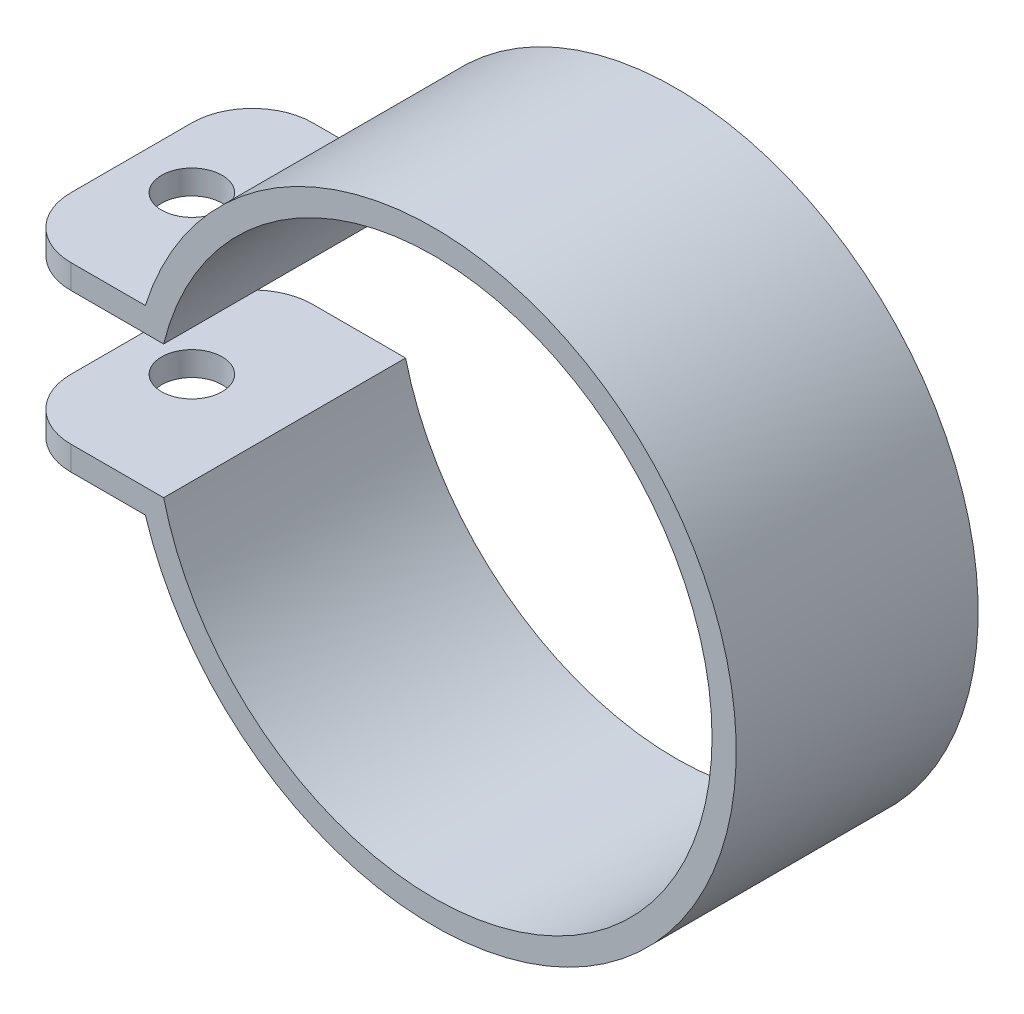
ISO-10303-21;
HEADER;
FILE_DESCRIPTION(('STEP AP214'),'2;1');
FILE_NAME('part.step','',(''),(''),'','','');
FILE_SCHEMA(('AUTOMOTIVE_DESIGN { 1 0 10303 214 1 1 1 1 }'));
ENDSEC;
DATA;
#1=APPLICATION_CONTEXT('core data for automotive mechanical design processes');
#2=APPLICATION_PROTOCOL_DEFINITION('international standard','automotive_design',2000,#1);
#3=PRODUCT_CONTEXT('',#1,'mechanical');
#4=PRODUCT('Part','Part','',(#3));
#5=PRODUCT_RELATED_PRODUCT_CATEGORY('part','',(#4));
#6=PRODUCT_DEFINITION_FORMATION('','',#4);
#7=PRODUCT_DEFINITION_CONTEXT('part definition',#1,'design');
#8=PRODUCT_DEFINITION('design','',#6,#7);
#9=PRODUCT_DEFINITION_SHAPE('','',#8);
#10=(LENGTH_UNIT() NAMED_UNIT(*) SI_UNIT(.MILLI.,.METRE.));
#11=(NAMED_UNIT(*) PLANE_ANGLE_UNIT() SI_UNIT($,.RADIAN.));
#12=(NAMED_UNIT(*) SI_UNIT($,.STERADIAN.) SOLID_ANGLE_UNIT());
#13=UNCERTAINTY_MEASURE_WITH_UNIT(LENGTH_MEASURE(1.E-05),#10,'distance_accuracy_value','');
#14=(GEOMETRIC_REPRESENTATION_CONTEXT(3) GLOBAL_UNCERTAINTY_ASSIGNED_CONTEXT((#13)) GLOBAL_UNIT_ASSIGNED_CONTEXT((#10,
#11,#12)) REPRESENTATION_CONTEXT('',''));
#15=CARTESIAN_POINT('',(0.,0.,0.));
#16=DIRECTION('',(0.,0.,1.));
#17=DIRECTION('',(1.,0.,0.));
#18=AXIS2_PLACEMENT_3D('',#15,#16,#17);
#19=CARTESIAN_POINT('',(-70.,-11.,20.));
#20=DIRECTION('',(1.,0.,0.));
#21=DIRECTION('',(0.,0.,-1.));
#22=AXIS2_PLACEMENT_3D('',#19,#20,#21);
#23=PLANE('',#22);
#24=DIRECTION('',(0.,0.,-1.));
#25=VECTOR('',#24,1.);
#26=CARTESIAN_POINT('',(-70.,-11.,20.));
#27=LINE('',#26,#25);
#28=CARTESIAN_POINT('',(-70.,-11.,10.));
#29=VERTEX_POINT('',#28);
#30=CARTESIAN_POINT('',(-70.,-11.,-10.));
#31=VERTEX_POINT('',#30);
#32=EDGE_CURVE('E179',#29,#31,#27,.T.);
#33=ORIENTED_EDGE('',*,*,#32,.T.);
#34=DIRECTION('',(0.,-1.,0.));
#35=VECTOR('',#34,1.);
#36=CARTESIAN_POINT('',(-70.,-11.,-10.));
#37=LINE('',#36,#35);
#38=CARTESIAN_POINT('',(-70.,-15.,-10.));
#39=VERTEX_POINT('',#38);
#40=EDGE_CURVE('E223',#31,#39,#37,.T.);
#41=ORIENTED_EDGE('',*,*,#40,.T.);
#42=DIRECTION('',(0.,0.,-1.));
#43=VECTOR('',#42,1.);
#44=CARTESIAN_POINT('',(-70.,-15.,20.));
#45=LINE('',#44,#43);
#46=CARTESIAN_POINT('',(-70.,-15.,10.));
#47=VERTEX_POINT('',#46);
#48=EDGE_CURVE('E157',#47,#39,#45,.T.);
#49=ORIENTED_EDGE('',*,*,#48,.F.);
#50=DIRECTION('',(0.,-1.,0.));
#51=VECTOR('',#50,1.);
#52=CARTESIAN_POINT('',(-70.,-11.,10.));
#53=LINE('',#52,#51);
#54=EDGE_CURVE('E220',#47,#29,#53,.F.);
#55=ORIENTED_EDGE('',*,*,#54,.T.);
#56=EDGE_LOOP('',(#33,#41,#49,#55));
#57=FACE_BOUND('',#56,.T.);
#58=ADVANCED_FACE('F43',(#57),#23,.F.);
#59=CARTESIAN_POINT('',(-70.,-15.,20.));
#60=DIRECTION('',(0.,1.,0.));
#61=DIRECTION('',(0.,0.,1.));
#62=AXIS2_PLACEMENT_3D('',#59,#60,#61);
#63=PLANE('',#62);
#64=CARTESIAN_POINT('',(-60.,-15.,0.));
#65=DIRECTION('',(0.,1.,0.));
#66=DIRECTION('',(0.,0.,1.));
#67=AXIS2_PLACEMENT_3D('',#64,#65,#66);
#68=CIRCLE('',#67,5.);
#69=CARTESIAN_POINT('',(-60.,-15.,5.));
#70=VERTEX_POINT('',#69);
#71=EDGE_CURVE('E183',#70,#70,#68,.T.);
#72=ORIENTED_EDGE('',*,*,#71,.T.);
#73=EDGE_LOOP('',(#72));
#74=FACE_BOUND('',#73,.T.);
#75=ORIENTED_EDGE('',*,*,#48,.T.);
#76=CARTESIAN_POINT('',(-60.,-15.,-10.));
#77=DIRECTION('',(0.,1.,0.));
#78=DIRECTION('',(0.,0.,1.));
#79=AXIS2_PLACEMENT_3D('',#76,#77,#78);
#80=CIRCLE('',#79,10.);
#81=CARTESIAN_POINT('',(-60.,-15.,-20.));
#82=VERTEX_POINT('',#81);
#83=EDGE_CURVE('E230',#39,#82,#80,.F.);
#84=ORIENTED_EDGE('',*,*,#83,.T.);
#85=DIRECTION('',(1.,0.,0.));
#86=VECTOR('',#85,1.);
#87=CARTESIAN_POINT('',(-70.,-15.,-20.));
#88=LINE('',#87,#86);
#89=CARTESIAN_POINT('',(-47.6969600708473,-15.,-20.));
#90=VERTEX_POINT('',#89);
#91=EDGE_CURVE('E153',#82,#90,#88,.T.);
#92=ORIENTED_EDGE('',*,*,#91,.T.);
#93=DIRECTION('',(0.,0.,-1.));
#94=VECTOR('',#93,1.);
#95=CARTESIAN_POINT('',(-47.6969600708473,-15.,20.));
#96=LINE('',#95,#94);
#97=CARTESIAN_POINT('',(-47.6969600708473,-15.,20.));
#98=VERTEX_POINT('',#97);
#99=EDGE_CURVE('E149',#98,#90,#96,.T.);
#100=ORIENTED_EDGE('',*,*,#99,.F.);
#101=DIRECTION('',(1.,0.,0.));
#102=VECTOR('',#101,1.);
#103=CARTESIAN_POINT('',(-70.,-15.,20.));
#104=LINE('',#103,#102);
#105=CARTESIAN_POINT('',(-60.,-15.,20.));
#106=VERTEX_POINT('',#105);
#107=EDGE_CURVE('E134',#106,#98,#104,.T.);
#108=ORIENTED_EDGE('',*,*,#107,.F.);
#109=CARTESIAN_POINT('',(-60.,-15.,10.));
#110=DIRECTION('',(0.,1.,0.));
#111=DIRECTION('',(0.,0.,1.));
#112=AXIS2_PLACEMENT_3D('',#109,#110,#111);
#113=CIRCLE('',#112,10.);
#114=EDGE_CURVE('E227',#106,#47,#113,.F.);
#115=ORIENTED_EDGE('',*,*,#114,.T.);
#116=EDGE_LOOP('',(#75,#84,#92,#100,#108,#115));
#117=FACE_BOUND('',#116,.T.);
#118=ADVANCED_FACE('F151',(#74,#117),#63,.F.);
#119=CARTESIAN_POINT('',(0.,0.,20.));
#120=DIRECTION('',(0.,0.,-1.));
#121=DIRECTION('',(-1.,0.,0.));
#122=AXIS2_PLACEMENT_3D('',#119,#120,#121);
#123=CYLINDRICAL_SURFACE('',#122,50.);
#124=CARTESIAN_POINT('',(0.,0.,-20.));
#125=DIRECTION('',(0.,0.,1.));
#126=DIRECTION('',(1.,0.,0.));
#127=AXIS2_PLACEMENT_3D('',#124,#125,#126);
#128=CIRCLE('',#127,50.);
#129=CARTESIAN_POINT('',(-47.6969600708473,15.,-20.));
#130=VERTEX_POINT('',#129);
#131=EDGE_CURVE('E182',#90,#130,#128,.T.);
#132=ORIENTED_EDGE('',*,*,#131,.T.);
#133=DIRECTION('',(0.,0.,-1.));
#134=VECTOR('',#133,1.);
#135=CARTESIAN_POINT('',(-47.6969600708473,15.,20.));
#136=LINE('',#135,#134);
#137=CARTESIAN_POINT('',(-47.6969600708473,15.,20.));
#138=VERTEX_POINT('',#137);
#139=EDGE_CURVE('E158',#138,#130,#136,.T.);
#140=ORIENTED_EDGE('',*,*,#139,.F.);
#141=CARTESIAN_POINT('',(0.,0.,20.));
#142=DIRECTION('',(0.,0.,1.));
#143=DIRECTION('',(1.,0.,0.));
#144=AXIS2_PLACEMENT_3D('',#141,#142,#143);
#145=CIRCLE('',#144,50.);
#146=EDGE_CURVE('E140',#98,#138,#145,.T.);
#147=ORIENTED_EDGE('',*,*,#146,.F.);
#148=ORIENTED_EDGE('',*,*,#99,.T.);
#149=EDGE_LOOP('',(#132,#140,#147,#148));
#150=FACE_BOUND('',#149,.T.);
#151=ADVANCED_FACE('F160',(#150),#123,.T.);
#152=CARTESIAN_POINT('',(-70.,15.,20.));
#153=DIRECTION('',(0.,-1.,0.));
#154=DIRECTION('',(0.,0.,-1.));
#155=AXIS2_PLACEMENT_3D('',#152,#153,#154);
#156=PLANE('',#155);
#157=CARTESIAN_POINT('',(-60.,15.,0.));
#158=DIRECTION('',(0.,1.,0.));
#159=DIRECTION('',(0.,0.,1.));
#160=AXIS2_PLACEMENT_3D('',#157,#158,#159);
#161=CIRCLE('',#160,5.);
#162=CARTESIAN_POINT('',(-60.,15.,5.));
#163=VERTEX_POINT('',#162);
#164=EDGE_CURVE('E355',#163,#163,#161,.T.);
#165=ORIENTED_EDGE('',*,*,#164,.F.);
#166=EDGE_LOOP('',(#165));
#167=FACE_BOUND('',#166,.T.);
#168=DIRECTION('',(-1.,0.,0.));
#169=VECTOR('',#168,1.);
#170=CARTESIAN_POINT('',(-70.,15.,-20.));
#171=LINE('',#170,#169);
#172=CARTESIAN_POINT('',(-60.,15.,-20.));
#173=VERTEX_POINT('',#172);
#174=EDGE_CURVE('E186',#130,#173,#171,.T.);
#175=ORIENTED_EDGE('',*,*,#174,.T.);
#176=CARTESIAN_POINT('',(-60.,15.,-10.));
#177=DIRECTION('',(0.,-1.,0.));
#178=DIRECTION('',(0.,0.,-1.));
#179=AXIS2_PLACEMENT_3D('',#176,#177,#178);
#180=CIRCLE('',#179,10.);
#181=CARTESIAN_POINT('',(-70.,15.,-10.));
#182=VERTEX_POINT('',#181);
#183=EDGE_CURVE('E11',#173,#182,#180,.F.);
#184=ORIENTED_EDGE('',*,*,#183,.T.);
#185=DIRECTION('',(0.,0.,-1.));
#186=VECTOR('',#185,1.);
#187=CARTESIAN_POINT('',(-70.,15.,20.));
#188=LINE('',#187,#186);
#189=CARTESIAN_POINT('',(-70.,15.,10.));
#190=VERTEX_POINT('',#189);
#191=EDGE_CURVE('E213',#190,#182,#188,.T.);
#192=ORIENTED_EDGE('',*,*,#191,.F.);
#193=CARTESIAN_POINT('',(-60.,15.,10.));
#194=DIRECTION('',(0.,-1.,0.));
#195=DIRECTION('',(0.,0.,-1.));
#196=AXIS2_PLACEMENT_3D('',#193,#194,#195);
#197=CIRCLE('',#196,10.);
#198=CARTESIAN_POINT('',(-60.,15.,20.));
#199=VERTEX_POINT('',#198);
#200=EDGE_CURVE('E53',#190,#199,#197,.F.);
#201=ORIENTED_EDGE('',*,*,#200,.T.);
#202=DIRECTION('',(-1.,0.,0.));
#203=VECTOR('',#202,1.);
#204=CARTESIAN_POINT('',(-70.,15.,20.));
#205=LINE('',#204,#203);
#206=EDGE_CURVE('E164',#138,#199,#205,.T.);
#207=ORIENTED_EDGE('',*,*,#206,.F.);
#208=ORIENTED_EDGE('',*,*,#139,.T.);
#209=EDGE_LOOP('',(#175,#184,#192,#201,#207,#208));
#210=FACE_BOUND('',#209,.T.);
#211=ADVANCED_FACE('F265',(#167,#210),#156,.F.);
#212=CARTESIAN_POINT('',(-70.,15.,20.));
#213=DIRECTION('',(1.,0.,0.));
#214=DIRECTION('',(0.,0.,-1.));
#215=AXIS2_PLACEMENT_3D('',#212,#213,#214);
#216=PLANE('',#215);
#217=ORIENTED_EDGE('',*,*,#191,.T.);
#218=DIRECTION('',(0.,-1.,0.));
#219=VECTOR('',#218,1.);
#220=CARTESIAN_POINT('',(-70.,15.,-10.));
#221=LINE('',#220,#219);
#222=CARTESIAN_POINT('',(-70.,11.,-10.));
#223=VERTEX_POINT('',#222);
#224=EDGE_CURVE('E253',#182,#223,#221,.T.);
#225=ORIENTED_EDGE('',*,*,#224,.T.);
#226=DIRECTION('',(0.,0.,-1.));
#227=VECTOR('',#226,1.);
#228=CARTESIAN_POINT('',(-70.,11.,20.));
#229=LINE('',#228,#227);
#230=CARTESIAN_POINT('',(-70.,11.,10.));
#231=VERTEX_POINT('',#230);
#232=EDGE_CURVE('E209',#231,#223,#229,.T.);
#233=ORIENTED_EDGE('',*,*,#232,.F.);
#234=DIRECTION('',(0.,-1.,0.));
#235=VECTOR('',#234,1.);
#236=CARTESIAN_POINT('',(-70.,15.,10.));
#237=LINE('',#236,#235);
#238=EDGE_CURVE('E65',#231,#190,#237,.F.);
#239=ORIENTED_EDGE('',*,*,#238,.T.);
#240=EDGE_LOOP('',(#217,#225,#233,#239));
#241=FACE_BOUND('',#240,.T.);
#242=ADVANCED_FACE('F272',(#241),#216,.F.);
#243=CARTESIAN_POINT('',(-70.,11.,20.));
#244=DIRECTION('',(0.,1.,0.));
#245=DIRECTION('',(0.,0.,1.));
#246=AXIS2_PLACEMENT_3D('',#243,#244,#245);
#247=PLANE('',#246);
#248=CARTESIAN_POINT('',(-60.,11.,0.));
#249=DIRECTION('',(0.,1.,0.));
#250=DIRECTION('',(0.,0.,1.));
#251=AXIS2_PLACEMENT_3D('',#248,#249,#250);
#252=CIRCLE('',#251,5.);
#253=CARTESIAN_POINT('',(-60.,11.,5.));
#254=VERTEX_POINT('',#253);
#255=EDGE_CURVE('E350',#254,#254,#252,.T.);
#256=ORIENTED_EDGE('',*,*,#255,.T.);
#257=EDGE_LOOP('',(#256));
#258=FACE_BOUND('',#257,.T.);
#259=ORIENTED_EDGE('',*,*,#232,.T.);
#260=CARTESIAN_POINT('',(-60.,11.,-10.));
#261=DIRECTION('',(0.,1.,0.));
#262=DIRECTION('',(0.,0.,1.));
#263=AXIS2_PLACEMENT_3D('',#260,#261,#262);
#264=CIRCLE('',#263,10.);
#265=CARTESIAN_POINT('',(-60.,11.,-20.));
#266=VERTEX_POINT('',#265);
#267=EDGE_CURVE('E260',#223,#266,#264,.F.);
#268=ORIENTED_EDGE('',*,*,#267,.T.);
#269=DIRECTION('',(1.,0.,0.));
#270=VECTOR('',#269,1.);
#271=CARTESIAN_POINT('',(-70.,11.,-20.));
#272=LINE('',#271,#270);
#273=CARTESIAN_POINT('',(-44.6654228682546,11.,-20.));
#274=VERTEX_POINT('',#273);
#275=EDGE_CURVE('E189',#266,#274,#272,.T.);
#276=ORIENTED_EDGE('',*,*,#275,.T.);
#277=DIRECTION('',(0.,0.,-1.));
#278=VECTOR('',#277,1.);
#279=CARTESIAN_POINT('',(-44.6654228682546,11.,20.));
#280=LINE('',#279,#278);
#281=CARTESIAN_POINT('',(-44.6654228682546,11.,20.));
#282=VERTEX_POINT('',#281);
#283=EDGE_CURVE('E205',#282,#274,#280,.T.);
#284=ORIENTED_EDGE('',*,*,#283,.F.);
#285=DIRECTION('',(1.,0.,0.));
#286=VECTOR('',#285,1.);
#287=CARTESIAN_POINT('',(-70.,11.,20.));
#288=LINE('',#287,#286);
#289=CARTESIAN_POINT('',(-60.,11.,20.));
#290=VERTEX_POINT('',#289);
#291=EDGE_CURVE('E167',#290,#282,#288,.T.);
#292=ORIENTED_EDGE('',*,*,#291,.F.);
#293=CARTESIAN_POINT('',(-60.,11.,10.));
#294=DIRECTION('',(0.,1.,0.));
#295=DIRECTION('',(0.,0.,1.));
#296=AXIS2_PLACEMENT_3D('',#293,#294,#295);
#297=CIRCLE('',#296,10.);
#298=EDGE_CURVE('E257',#290,#231,#297,.F.);
#299=ORIENTED_EDGE('',*,*,#298,.T.);
#300=EDGE_LOOP('',(#259,#268,#276,#284,#292,#299));
#301=FACE_BOUND('',#300,.T.);
#302=ADVANCED_FACE('F270',(#258,#301),#247,.F.);
#303=CARTESIAN_POINT('',(0.,0.,20.));
#304=DIRECTION('',(0.,0.,-1.));
#305=DIRECTION('',(-1.,0.,0.));
#306=AXIS2_PLACEMENT_3D('',#303,#304,#305);
#307=CYLINDRICAL_SURFACE('',#306,46.);
#308=CARTESIAN_POINT('',(0.,0.,-20.));
#309=DIRECTION('',(0.,0.,-1.));
#310=DIRECTION('',(1.,0.,0.));
#311=AXIS2_PLACEMENT_3D('',#308,#309,#310);
#312=CIRCLE('',#311,46.);
#313=CARTESIAN_POINT('',(-44.6654228682546,-11.,-20.));
#314=VERTEX_POINT('',#313);
#315=EDGE_CURVE('E192',#274,#314,#312,.T.);
#316=ORIENTED_EDGE('',*,*,#315,.T.);
#317=DIRECTION('',(0.,0.,-1.));
#318=VECTOR('',#317,1.);
#319=CARTESIAN_POINT('',(-44.6654228682546,-11.,20.));
#320=LINE('',#319,#318);
#321=CARTESIAN_POINT('',(-44.6654228682546,-11.,20.));
#322=VERTEX_POINT('',#321);
#323=EDGE_CURVE('E201',#322,#314,#320,.T.);
#324=ORIENTED_EDGE('',*,*,#323,.F.);
#325=CARTESIAN_POINT('',(0.,0.,20.));
#326=DIRECTION('',(0.,0.,-1.));
#327=DIRECTION('',(1.,0.,0.));
#328=AXIS2_PLACEMENT_3D('',#325,#326,#327);
#329=CIRCLE('',#328,46.);
#330=EDGE_CURVE('E173',#282,#322,#329,.T.);
#331=ORIENTED_EDGE('',*,*,#330,.F.);
#332=ORIENTED_EDGE('',*,*,#283,.T.);
#333=EDGE_LOOP('',(#316,#324,#331,#332));
#334=FACE_BOUND('',#333,.T.);
#335=ADVANCED_FACE('F285',(#334),#307,.F.);
#336=CARTESIAN_POINT('',(-70.,-11.,20.));
#337=DIRECTION('',(0.,-1.,0.));
#338=DIRECTION('',(0.,0.,-1.));
#339=AXIS2_PLACEMENT_3D('',#336,#337,#338);
#340=PLANE('',#339);
#341=CARTESIAN_POINT('',(-60.,-11.,0.));
#342=DIRECTION('',(0.,-1.,0.));
#343=DIRECTION('',(0.,0.,-1.));
#344=AXIS2_PLACEMENT_3D('',#341,#342,#343);
#345=CIRCLE('',#344,5.);
#346=CARTESIAN_POINT('',(-60.,-11.,-5.));
#347=VERTEX_POINT('',#346);
#348=EDGE_CURVE('E47',#347,#347,#345,.T.);
#349=ORIENTED_EDGE('',*,*,#348,.T.);
#350=EDGE_LOOP('',(#349));
#351=FACE_BOUND('',#350,.T.);
#352=DIRECTION('',(-1.,0.,0.));
#353=VECTOR('',#352,1.);
#354=CARTESIAN_POINT('',(-70.,-11.,-20.));
#355=LINE('',#354,#353);
#356=CARTESIAN_POINT('',(-60.,-11.,-20.));
#357=VERTEX_POINT('',#356);
#358=EDGE_CURVE('E146',#314,#357,#355,.T.);
#359=ORIENTED_EDGE('',*,*,#358,.T.);
#360=CARTESIAN_POINT('',(-60.,-11.,-10.));
#361=DIRECTION('',(0.,-1.,0.));
#362=DIRECTION('',(0.,0.,-1.));
#363=AXIS2_PLACEMENT_3D('',#360,#361,#362);
#364=CIRCLE('',#363,10.);
#365=EDGE_CURVE('E242',#357,#31,#364,.F.);
#366=ORIENTED_EDGE('',*,*,#365,.T.);
#367=ORIENTED_EDGE('',*,*,#32,.F.);
#368=CARTESIAN_POINT('',(-60.,-11.,10.));
#369=DIRECTION('',(0.,-1.,0.));
#370=DIRECTION('',(0.,0.,-1.));
#371=AXIS2_PLACEMENT_3D('',#368,#369,#370);
#372=CIRCLE('',#371,10.);
#373=CARTESIAN_POINT('',(-60.,-11.,20.));
#374=VERTEX_POINT('',#373);
#375=EDGE_CURVE('E239',#29,#374,#372,.F.);
#376=ORIENTED_EDGE('',*,*,#375,.T.);
#377=DIRECTION('',(-1.,0.,0.));
#378=VECTOR('',#377,1.);
#379=CARTESIAN_POINT('',(-70.,-11.,20.));
#380=LINE('',#379,#378);
#381=EDGE_CURVE('E176',#322,#374,#380,.T.);
#382=ORIENTED_EDGE('',*,*,#381,.F.);
#383=ORIENTED_EDGE('',*,*,#323,.T.);
#384=EDGE_LOOP('',(#359,#366,#367,#376,#382,#383));
#385=FACE_BOUND('',#384,.T.);
#386=ADVANCED_FACE('F289',(#351,#385),#340,.F.);
#387=CARTESIAN_POINT('',(0.,0.,20.));
#388=DIRECTION('',(0.,0.,1.));
#389=DIRECTION('',(1.,0.,0.));
#390=AXIS2_PLACEMENT_3D('',#387,#388,#389);
#391=PLANE('',#390);
#392=ORIENTED_EDGE('',*,*,#381,.T.);
#393=DIRECTION('',(0.,-1.,0.));
#394=VECTOR('',#393,1.);
#395=CARTESIAN_POINT('',(-60.,-15.,20.));
#396=LINE('',#395,#394);
#397=EDGE_CURVE('E143',#374,#106,#396,.T.);
#398=ORIENTED_EDGE('',*,*,#397,.T.);
#399=ORIENTED_EDGE('',*,*,#107,.T.);
#400=ORIENTED_EDGE('',*,*,#146,.T.);
#401=ORIENTED_EDGE('',*,*,#206,.T.);
#402=DIRECTION('',(0.,-1.,0.));
#403=VECTOR('',#402,1.);
#404=CARTESIAN_POINT('',(-60.,11.,20.));
#405=LINE('',#404,#403);
#406=EDGE_CURVE('E245',#199,#290,#405,.T.);
#407=ORIENTED_EDGE('',*,*,#406,.T.);
#408=ORIENTED_EDGE('',*,*,#291,.T.);
#409=ORIENTED_EDGE('',*,*,#330,.T.);
#410=EDGE_LOOP('',(#392,#398,#399,#400,#401,#407,#408,#409));
#411=FACE_BOUND('',#410,.T.);
#412=ADVANCED_FACE('F137',(#411),#391,.T.);
#413=CARTESIAN_POINT('',(0.,0.,-20.));
#414=DIRECTION('',(0.,0.,1.));
#415=DIRECTION('',(1.,0.,0.));
#416=AXIS2_PLACEMENT_3D('',#413,#414,#415);
#417=PLANE('',#416);
#418=ORIENTED_EDGE('',*,*,#91,.F.);
#419=DIRECTION('',(0.,-1.,0.));
#420=VECTOR('',#419,1.);
#421=CARTESIAN_POINT('',(-60.,0.,-20.));
#422=LINE('',#421,#420);
#423=EDGE_CURVE('E236',#82,#357,#422,.F.);
#424=ORIENTED_EDGE('',*,*,#423,.T.);
#425=ORIENTED_EDGE('',*,*,#358,.F.);
#426=ORIENTED_EDGE('',*,*,#315,.F.);
#427=ORIENTED_EDGE('',*,*,#275,.F.);
#428=DIRECTION('',(0.,-1.,0.));
#429=VECTOR('',#428,1.);
#430=CARTESIAN_POINT('',(-60.,0.,-20.));
#431=LINE('',#430,#429);
#432=EDGE_CURVE('E233',#266,#173,#431,.F.);
#433=ORIENTED_EDGE('',*,*,#432,.T.);
#434=ORIENTED_EDGE('',*,*,#174,.F.);
#435=ORIENTED_EDGE('',*,*,#131,.F.);
#436=EDGE_LOOP('',(#418,#424,#425,#426,#427,#433,#434,#435));
#437=FACE_BOUND('',#436,.T.);
#438=ADVANCED_FACE('F280',(#437),#417,.F.);
#439=CARTESIAN_POINT('',(-60.,-11.,-10.));
#440=DIRECTION('',(0.,-1.,0.));
#441=DIRECTION('',(0.,0.,-1.));
#442=AXIS2_PLACEMENT_3D('',#439,#440,#441);
#443=CYLINDRICAL_SURFACE('',#442,10.);
#444=ORIENTED_EDGE('',*,*,#365,.F.);
#445=ORIENTED_EDGE('',*,*,#423,.F.);
#446=ORIENTED_EDGE('',*,*,#83,.F.);
#447=ORIENTED_EDGE('',*,*,#40,.F.);
#448=EDGE_LOOP('',(#444,#445,#446,#447));
#449=FACE_BOUND('',#448,.T.);
#450=ADVANCED_FACE('F300',(#449),#443,.T.);
#451=CARTESIAN_POINT('',(-60.,0.,10.));
#452=DIRECTION('',(0.,1.,0.));
#453=DIRECTION('',(0.,0.,1.));
#454=AXIS2_PLACEMENT_3D('',#451,#452,#453);
#455=CYLINDRICAL_SURFACE('',#454,10.);
#456=ORIENTED_EDGE('',*,*,#375,.F.);
#457=ORIENTED_EDGE('',*,*,#54,.F.);
#458=ORIENTED_EDGE('',*,*,#114,.F.);
#459=ORIENTED_EDGE('',*,*,#397,.F.);
#460=EDGE_LOOP('',(#456,#457,#458,#459));
#461=FACE_BOUND('',#460,.T.);
#462=ADVANCED_FACE('F294',(#461),#455,.T.);
#463=CARTESIAN_POINT('',(-60.,15.,-10.));
#464=DIRECTION('',(0.,-1.,0.));
#465=DIRECTION('',(0.,0.,-1.));
#466=AXIS2_PLACEMENT_3D('',#463,#464,#465);
#467=CYLINDRICAL_SURFACE('',#466,10.);
#468=ORIENTED_EDGE('',*,*,#183,.F.);
#469=ORIENTED_EDGE('',*,*,#432,.F.);
#470=ORIENTED_EDGE('',*,*,#267,.F.);
#471=ORIENTED_EDGE('',*,*,#224,.F.);
#472=EDGE_LOOP('',(#468,#469,#470,#471));
#473=FACE_BOUND('',#472,.T.);
#474=ADVANCED_FACE('F275',(#473),#467,.T.);
#475=CARTESIAN_POINT('',(-60.,0.,10.));
#476=DIRECTION('',(0.,1.,0.));
#477=DIRECTION('',(0.,0.,1.));
#478=AXIS2_PLACEMENT_3D('',#475,#476,#477);
#479=CYLINDRICAL_SURFACE('',#478,10.);
#480=ORIENTED_EDGE('',*,*,#200,.F.);
#481=ORIENTED_EDGE('',*,*,#238,.F.);
#482=ORIENTED_EDGE('',*,*,#298,.F.);
#483=ORIENTED_EDGE('',*,*,#406,.F.);
#484=EDGE_LOOP('',(#480,#481,#482,#483));
#485=FACE_BOUND('',#484,.T.);
#486=ADVANCED_FACE('F45',(#485),#479,.T.);
#487=CARTESIAN_POINT('',(-60.,-25.,0.));
#488=DIRECTION('',(0.,1.,0.));
#489=DIRECTION('',(0.,0.,1.));
#490=AXIS2_PLACEMENT_3D('',#487,#488,#489);
#491=CYLINDRICAL_SURFACE('',#490,5.);
#492=ORIENTED_EDGE('',*,*,#348,.F.);
#493=EDGE_LOOP('',(#492));
#494=FACE_BOUND('',#493,.T.);
#495=ORIENTED_EDGE('',*,*,#71,.F.);
#496=EDGE_LOOP('',(#495));
#497=FACE_BOUND('',#496,.T.);
#498=ADVANCED_FACE('F335',(#494,#497),#491,.F.);
#499=ORIENTED_EDGE('',*,*,#164,.T.);
#500=EDGE_LOOP('',(#499));
#501=FACE_BOUND('',#500,.T.);
#502=ORIENTED_EDGE('',*,*,#255,.F.);
#503=EDGE_LOOP('',(#502));
#504=FACE_BOUND('',#503,.T.);
#505=ADVANCED_FACE('F337',(#501,#504),#491,.F.);
#506=CLOSED_SHELL('',(#58,#118,#151,#211,#242,#302,#335,#386,#412,#438,#450,#462,#474,#486,#498,#505));
#507=MANIFOLD_SOLID_BREP('B2',#506);
#508=ADVANCED_BREP_SHAPE_REPRESENTATION('',(#18,#507),#14);
#509=SHAPE_DEFINITION_REPRESENTATION(#9,#508);
ENDSEC;
END-ISO-10303-21;
